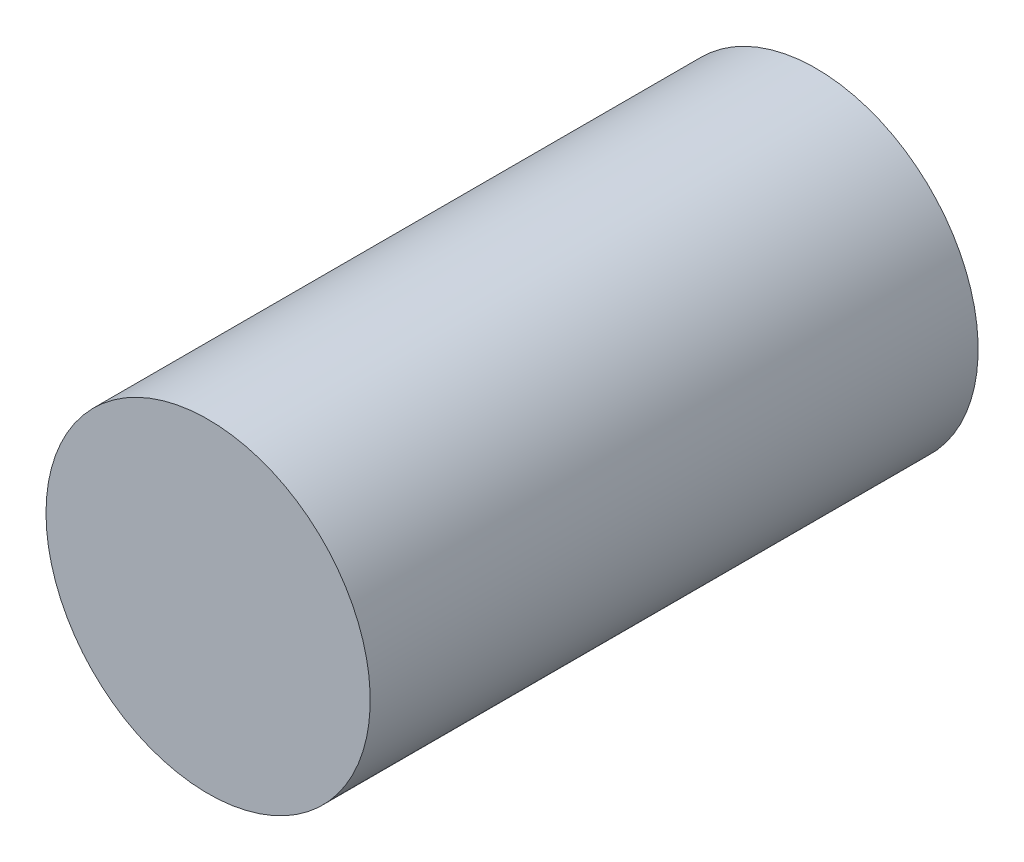
ISO-10303-21;
HEADER;
FILE_DESCRIPTION(('STEP AP214'),'2;1');
FILE_NAME('part.step','',(''),(''),'','','');
FILE_SCHEMA(('AUTOMOTIVE_DESIGN { 1 0 10303 214 1 1 1 1 }'));
ENDSEC;
DATA;
#1=APPLICATION_CONTEXT('core data for automotive mechanical design processes');
#2=APPLICATION_PROTOCOL_DEFINITION('international standard','automotive_design',2000,#1);
#3=PRODUCT_CONTEXT('',#1,'mechanical');
#4=PRODUCT('Part','Part','',(#3));
#5=PRODUCT_RELATED_PRODUCT_CATEGORY('part','',(#4));
#6=PRODUCT_DEFINITION_FORMATION('','',#4);
#7=PRODUCT_DEFINITION_CONTEXT('part definition',#1,'design');
#8=PRODUCT_DEFINITION('design','',#6,#7);
#9=PRODUCT_DEFINITION_SHAPE('','',#8);
#10=(LENGTH_UNIT() NAMED_UNIT(*) SI_UNIT(.MILLI.,.METRE.));
#11=(NAMED_UNIT(*) PLANE_ANGLE_UNIT() SI_UNIT($,.RADIAN.));
#12=(NAMED_UNIT(*) SI_UNIT($,.STERADIAN.) SOLID_ANGLE_UNIT());
#13=UNCERTAINTY_MEASURE_WITH_UNIT(LENGTH_MEASURE(1.E-05),#10,'distance_accuracy_value','');
#14=(GEOMETRIC_REPRESENTATION_CONTEXT(3) GLOBAL_UNCERTAINTY_ASSIGNED_CONTEXT((#13)) GLOBAL_UNIT_ASSIGNED_CONTEXT((#10,
#11,#12)) REPRESENTATION_CONTEXT('',''));
#15=CARTESIAN_POINT('',(0.,0.,0.));
#16=DIRECTION('',(0.,0.,1.));
#17=DIRECTION('',(1.,0.,0.));
#18=AXIS2_PLACEMENT_3D('',#15,#16,#17);
#19=CARTESIAN_POINT('',(0.,0.,11.25));
#20=DIRECTION('',(0.,0.,-1.));
#21=DIRECTION('',(-1.,0.,0.));
#22=AXIS2_PLACEMENT_3D('',#19,#20,#21);
#23=CYLINDRICAL_SURFACE('',#22,3.);
#24=CARTESIAN_POINT('',(0.,0.,11.25));
#25=DIRECTION('',(0.,0.,1.));
#26=DIRECTION('',(-1.,0.,0.));
#27=AXIS2_PLACEMENT_3D('',#24,#25,#26);
#28=CIRCLE('',#27,3.);
#29=CARTESIAN_POINT('',(-3.,0.,11.25));
#30=VERTEX_POINT('',#29);
#31=EDGE_CURVE('E10',#30,#30,#28,.T.);
#32=CARTESIAN_POINT('',(0.,0.,0.));
#33=DIRECTION('',(0.,0.,1.));
#34=DIRECTION('',(-1.,0.,0.));
#35=AXIS2_PLACEMENT_3D('',#32,#33,#34);
#36=CIRCLE('',#35,3.);
#37=CARTESIAN_POINT('',(-3.,0.,0.));
#38=VERTEX_POINT('',#37);
#39=EDGE_CURVE('E35',#38,#38,#36,.T.);
#40=CARTESIAN_POINT('',(-3.,0.,11.25));
#41=CARTESIAN_POINT('',(-3.,0.,11.1328125));
#42=CARTESIAN_POINT('',(-3.,0.,11.015625));
#43=CARTESIAN_POINT('',(-3.,0.,10.78125));
#44=CARTESIAN_POINT('',(-3.,0.,10.6640625));
#45=CARTESIAN_POINT('',(-3.,0.,10.4296875));
#46=CARTESIAN_POINT('',(-3.,0.,10.3125));
#47=CARTESIAN_POINT('',(-3.,0.,10.078125));
#48=CARTESIAN_POINT('',(-3.,0.,9.9609375));
#49=CARTESIAN_POINT('',(-3.,0.,9.7265625));
#50=CARTESIAN_POINT('',(-3.,0.,9.609375));
#51=CARTESIAN_POINT('',(-3.,0.,9.375));
#52=CARTESIAN_POINT('',(-3.,0.,9.2578125));
#53=CARTESIAN_POINT('',(-3.,0.,9.0234375));
#54=CARTESIAN_POINT('',(-3.,0.,8.90625));
#55=CARTESIAN_POINT('',(-3.,0.,8.671875));
#56=CARTESIAN_POINT('',(-3.,0.,8.5546875));
#57=CARTESIAN_POINT('',(-3.,0.,8.3203125));
#58=CARTESIAN_POINT('',(-3.,0.,8.203125));
#59=CARTESIAN_POINT('',(-3.,0.,7.96875));
#60=CARTESIAN_POINT('',(-3.,0.,7.8515625));
#61=CARTESIAN_POINT('',(-3.,0.,7.6171875));
#62=CARTESIAN_POINT('',(-3.,0.,7.5));
#63=CARTESIAN_POINT('',(-3.,0.,7.265625));
#64=CARTESIAN_POINT('',(-3.,0.,7.1484375));
#65=CARTESIAN_POINT('',(-3.,0.,6.9140625));
#66=CARTESIAN_POINT('',(-3.,0.,6.796875));
#67=CARTESIAN_POINT('',(-3.,0.,6.5625));
#68=CARTESIAN_POINT('',(-3.,0.,6.4453125));
#69=CARTESIAN_POINT('',(-3.,0.,6.2109375));
#70=CARTESIAN_POINT('',(-3.,0.,6.09375));
#71=CARTESIAN_POINT('',(-3.,0.,5.859375));
#72=CARTESIAN_POINT('',(-3.,0.,5.7421875));
#73=CARTESIAN_POINT('',(-3.,0.,5.5078125));
#74=CARTESIAN_POINT('',(-3.,0.,5.390625));
#75=CARTESIAN_POINT('',(-3.,0.,5.15625));
#76=CARTESIAN_POINT('',(-3.,0.,5.0390625));
#77=CARTESIAN_POINT('',(-3.,0.,4.8046875));
#78=CARTESIAN_POINT('',(-3.,0.,4.6875));
#79=CARTESIAN_POINT('',(-3.,0.,4.453125));
#80=CARTESIAN_POINT('',(-3.,0.,4.3359375));
#81=CARTESIAN_POINT('',(-3.,0.,4.1015625));
#82=CARTESIAN_POINT('',(-3.,0.,3.984375));
#83=CARTESIAN_POINT('',(-3.,0.,3.75));
#84=CARTESIAN_POINT('',(-3.,0.,3.6328125));
#85=CARTESIAN_POINT('',(-3.,0.,3.3984375));
#86=CARTESIAN_POINT('',(-3.,0.,3.28125));
#87=CARTESIAN_POINT('',(-3.,0.,3.046875));
#88=CARTESIAN_POINT('',(-3.,0.,2.9296875));
#89=CARTESIAN_POINT('',(-3.,0.,2.6953125));
#90=CARTESIAN_POINT('',(-3.,0.,2.578125));
#91=CARTESIAN_POINT('',(-3.,0.,2.34375));
#92=CARTESIAN_POINT('',(-3.,0.,2.2265625));
#93=CARTESIAN_POINT('',(-3.,0.,1.9921875));
#94=CARTESIAN_POINT('',(-3.,0.,1.875));
#95=CARTESIAN_POINT('',(-3.,0.,1.640625));
#96=CARTESIAN_POINT('',(-3.,0.,1.5234375));
#97=CARTESIAN_POINT('',(-3.,0.,1.2890625));
#98=CARTESIAN_POINT('',(-3.,0.,1.171875));
#99=CARTESIAN_POINT('',(-3.,0.,0.937499999999999));
#100=CARTESIAN_POINT('',(-3.,0.,0.820312499999999));
#101=CARTESIAN_POINT('',(-3.,0.,0.585937499999998));
#102=CARTESIAN_POINT('',(-3.,0.,0.468749999999998));
#103=CARTESIAN_POINT('',(-3.,0.,0.234374999999998));
#104=CARTESIAN_POINT('',(-3.,0.,0.117187499999998));
#105=CARTESIAN_POINT('',(-3.,0.,0.));
#106=B_SPLINE_CURVE_WITH_KNOTS('',3,(#40,#41,#42,#43,#44,#45,#46,#47,#48,#49,#50,#51,#52,#53,
#54,#55,#56,#57,#58,#59,#60,#61,#62,#63,#64,#65,#66,#67,#68,#69,#70,#71,#72,#73,#74,#75,#76,#77,
#78,#79,#80,#81,#82,#83,#84,#85,#86,#87,#88,#89,#90,#91,#92,#93,#94,#95,#96,#97,#98,#99,#100,
#101,#102,#103,#104,#105),.UNSPECIFIED.,.F.,.F.,(4,2,2,2,2,2,2,2,2,2,2,2,2,2,2,2,2,2,2,2,2,2,2,
2,2,2,2,2,2,2,2,2,4),(0.,0.351562499999999,0.703124999999999,1.0546875,1.40625,1.7578125,
2.109375,2.4609375,2.8125,3.1640625,3.515625,3.8671875,4.21875,4.5703125,4.921875,5.2734375,
5.625,5.9765625,6.328125,6.6796875,7.03125,7.3828125,7.734375,8.0859375,8.4375,8.7890625,
9.140625,9.4921875,9.84375,10.1953125,10.546875,10.8984375,11.25),.UNSPECIFIED.);
#107=EDGE_CURVE('BSEAM32',#30,#38,#106,.T.);
#108=ORIENTED_EDGE('',*,*,#31,.F.);
#109=ORIENTED_EDGE('',*,*,#39,.T.);
#110=ORIENTED_EDGE('',*,*,#107,.T.);
#111=ORIENTED_EDGE('',*,*,#107,.F.);
#112=EDGE_LOOP('',(#108,#110,#109,#111));
#113=FACE_BOUND('',#112,.T.);
#114=ADVANCED_FACE('F32',(#113),#23,.T.);
#115=CARTESIAN_POINT('',(0.,0.,11.25));
#116=DIRECTION('',(0.,0.,-1.));
#117=DIRECTION('',(-1.,0.,0.));
#118=AXIS2_PLACEMENT_3D('',#115,#116,#117);
#119=PLANE('',#118);
#120=ORIENTED_EDGE('',*,*,#31,.T.);
#121=EDGE_LOOP('',(#120));
#122=FACE_BOUND('',#121,.T.);
#123=ADVANCED_FACE('F47',(#122),#119,.F.);
#124=CARTESIAN_POINT('',(0.,0.,0.));
#125=DIRECTION('',(0.,0.,-1.));
#126=DIRECTION('',(-1.,0.,0.));
#127=AXIS2_PLACEMENT_3D('',#124,#125,#126);
#128=PLANE('',#127);
#129=ORIENTED_EDGE('',*,*,#39,.F.);
#130=EDGE_LOOP('',(#129));
#131=FACE_BOUND('',#130,.T.);
#132=ADVANCED_FACE('F45',(#131),#128,.T.);
#133=CLOSED_SHELL('',(#114,#123,#132));
#134=MANIFOLD_SOLID_BREP('B2',#133);
#135=ADVANCED_BREP_SHAPE_REPRESENTATION('',(#18,#134),#14);
#136=SHAPE_DEFINITION_REPRESENTATION(#9,#135);
ENDSEC;
END-ISO-10303-21;
